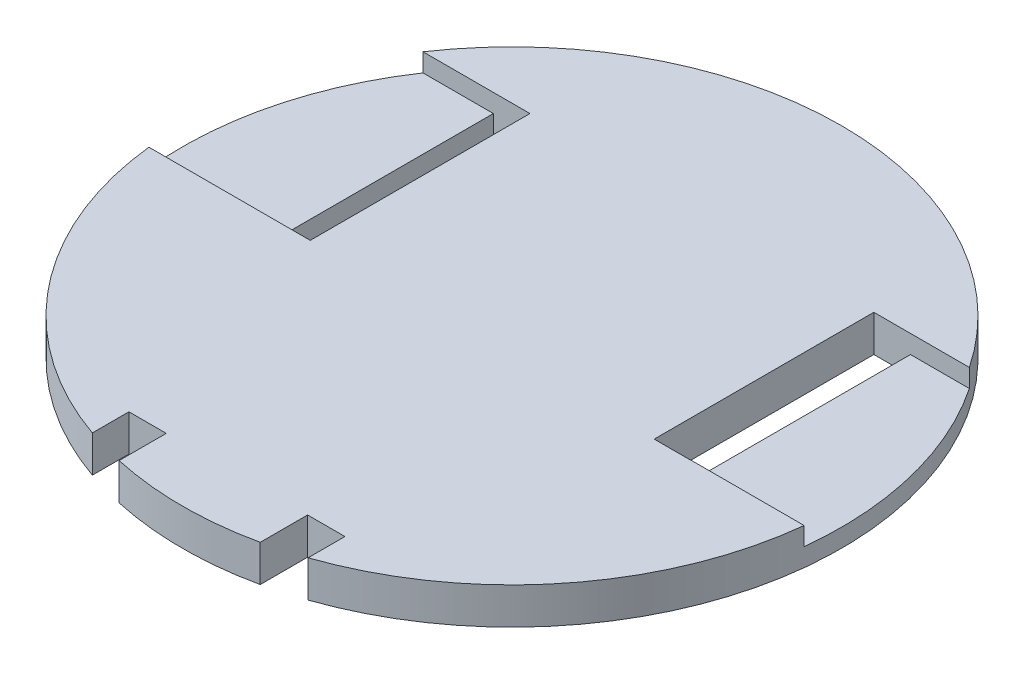
ISO-10303-21;
HEADER;
FILE_DESCRIPTION(('STEP AP214'),'2;1');
FILE_NAME('part.step','',(''),(''),'','','');
FILE_SCHEMA(('AUTOMOTIVE_DESIGN { 1 0 10303 214 1 1 1 1 }'));
ENDSEC;
DATA;
#1=APPLICATION_CONTEXT('core data for automotive mechanical design processes');
#2=APPLICATION_PROTOCOL_DEFINITION('international standard','automotive_design',2000,#1);
#3=PRODUCT_CONTEXT('',#1,'mechanical');
#4=PRODUCT('Part','Part','',(#3));
#5=PRODUCT_RELATED_PRODUCT_CATEGORY('part','',(#4));
#6=PRODUCT_DEFINITION_FORMATION('','',#4);
#7=PRODUCT_DEFINITION_CONTEXT('part definition',#1,'design');
#8=PRODUCT_DEFINITION('design','',#6,#7);
#9=PRODUCT_DEFINITION_SHAPE('','',#8);
#10=(LENGTH_UNIT() NAMED_UNIT(*) SI_UNIT(.MILLI.,.METRE.));
#11=(NAMED_UNIT(*) PLANE_ANGLE_UNIT() SI_UNIT($,.RADIAN.));
#12=(NAMED_UNIT(*) SI_UNIT($,.STERADIAN.) SOLID_ANGLE_UNIT());
#13=UNCERTAINTY_MEASURE_WITH_UNIT(LENGTH_MEASURE(1.E-05),#10,'distance_accuracy_value','');
#14=(GEOMETRIC_REPRESENTATION_CONTEXT(3) GLOBAL_UNCERTAINTY_ASSIGNED_CONTEXT((#13)) GLOBAL_UNIT_ASSIGNED_CONTEXT((#10,
#11,#12)) REPRESENTATION_CONTEXT('',''));
#15=CARTESIAN_POINT('',(0.,0.,0.));
#16=DIRECTION('',(0.,0.,1.));
#17=DIRECTION('',(1.,0.,0.));
#18=AXIS2_PLACEMENT_3D('',#15,#16,#17);
#19=CARTESIAN_POINT('',(-32.8829925528988,12.7,-35.0409389391828));
#20=DIRECTION('',(0.,-1.,0.));
#21=DIRECTION('',(0.,0.,-1.));
#22=AXIS2_PLACEMENT_3D('',#19,#20,#21);
#23=CYLINDRICAL_SURFACE('',#22,114.3);
#24=DIRECTION('',(0.,-1.,0.));
#25=VECTOR('',#24,1.);
#26=CARTESIAN_POINT('',(-57.5479572401736,12.7,76.5660927253835));
#27=LINE('',#26,#25);
#28=CARTESIAN_POINT('',(-57.5479572401736,0.,76.5660927253835));
#29=VERTEX_POINT('',#28);
#30=CARTESIAN_POINT('',(-57.5479572401736,12.7,76.5660927253835));
#31=VERTEX_POINT('',#30);
#32=EDGE_CURVE('E195',#29,#31,#27,.F.);
#33=ORIENTED_EDGE('',*,*,#32,.F.);
#34=CARTESIAN_POINT('',(-32.8829925528988,0.,-35.0409389391828));
#35=DIRECTION('',(0.,1.,0.));
#36=DIRECTION('',(0.,0.,1.));
#37=AXIS2_PLACEMENT_3D('',#34,#35,#36);
#38=CIRCLE('',#37,114.3);
#39=CARTESIAN_POINT('',(-8.52595724017365,0.,76.6336993220387));
#40=VERTEX_POINT('',#39);
#41=EDGE_CURVE('E286',#29,#40,#38,.T.);
#42=ORIENTED_EDGE('',*,*,#41,.T.);
#43=DIRECTION('',(0.,-1.,0.));
#44=VECTOR('',#43,1.);
#45=CARTESIAN_POINT('',(-8.52595724017366,12.7,76.6336993220387));
#46=LINE('',#45,#44);
#47=CARTESIAN_POINT('',(-8.52595724017365,12.7,76.6336993220387));
#48=VERTEX_POINT('',#47);
#49=EDGE_CURVE('E214',#40,#48,#46,.F.);
#50=ORIENTED_EDGE('',*,*,#49,.T.);
#51=CARTESIAN_POINT('',(-32.8829925528988,12.7,-35.0409389391828));
#52=DIRECTION('',(0.,1.,0.));
#53=DIRECTION('',(0.,0.,1.));
#54=AXIS2_PLACEMENT_3D('',#51,#52,#53);
#55=CIRCLE('',#54,114.3);
#56=EDGE_CURVE('E315',#31,#48,#55,.T.);
#57=ORIENTED_EDGE('',*,*,#56,.F.);
#58=EDGE_LOOP('',(#33,#42,#50,#57));
#59=FACE_BOUND('',#58,.T.);
#60=ADVANCED_FACE('F48',(#59),#23,.T.);
#61=CARTESIAN_POINT('',(4.42804275982635,0.,72.9978348593595));
#62=VERTEX_POINT('',#61);
#63=CARTESIAN_POINT('',(-70.5019572401736,0.,72.8910002440709));
#64=VERTEX_POINT('',#63);
#65=EDGE_CURVE('E319',#62,#64,#38,.T.);
#66=ORIENTED_EDGE('',*,*,#65,.T.);
#67=DIRECTION('',(0.,-1.,0.));
#68=VECTOR('',#67,1.);
#69=CARTESIAN_POINT('',(-70.5019572401736,12.7,72.8910002440709));
#70=LINE('',#69,#68);
#71=CARTESIAN_POINT('',(-70.5019572401736,12.7,72.8910002440709));
#72=VERTEX_POINT('',#71);
#73=EDGE_CURVE('E230',#64,#72,#70,.F.);
#74=ORIENTED_EDGE('',*,*,#73,.T.);
#75=CARTESIAN_POINT('',(-146.519377255521,12.7,-22.7420742876122));
#76=VERTEX_POINT('',#75);
#77=EDGE_CURVE('E312',#76,#72,#55,.T.);
#78=ORIENTED_EDGE('',*,*,#77,.F.);
#79=DIRECTION('',(0.,1.,0.));
#80=VECTOR('',#79,1.);
#81=CARTESIAN_POINT('',(-146.519377255521,6.35,-22.7420742876122));
#82=LINE('',#81,#80);
#83=CARTESIAN_POINT('',(-146.519377255521,6.35,-22.7420742876122));
#84=VERTEX_POINT('',#83);
#85=EDGE_CURVE('E246',#84,#76,#82,.T.);
#86=ORIENTED_EDGE('',*,*,#85,.F.);
#87=CARTESIAN_POINT('',(-32.8829925528988,6.35,-35.0409389391828));
#88=DIRECTION('',(0.,1.,0.));
#89=DIRECTION('',(0.,0.,1.));
#90=AXIS2_PLACEMENT_3D('',#87,#88,#89);
#91=CIRCLE('',#90,114.3);
#92=CARTESIAN_POINT('',(-127.651842399152,6.35,-98.9420742876122));
#93=VERTEX_POINT('',#92);
#94=EDGE_CURVE('E235',#93,#84,#91,.T.);
#95=ORIENTED_EDGE('',*,*,#94,.F.);
#96=DIRECTION('',(0.,1.,0.));
#97=VECTOR('',#96,1.);
#98=CARTESIAN_POINT('',(-127.651842399152,6.35,-98.9420742876122));
#99=LINE('',#98,#97);
#100=CARTESIAN_POINT('',(-127.651842399152,12.7,-98.9420742876122));
#101=VERTEX_POINT('',#100);
#102=EDGE_CURVE('E247',#93,#101,#99,.T.);
#103=ORIENTED_EDGE('',*,*,#102,.T.);
#104=CARTESIAN_POINT('',(61.9239866861581,12.7,-98.8854899013835));
#105=VERTEX_POINT('',#104);
#106=EDGE_CURVE('E314',#105,#101,#55,.T.);
#107=ORIENTED_EDGE('',*,*,#106,.F.);
#108=DIRECTION('',(0.,1.,0.));
#109=VECTOR('',#108,1.);
#110=CARTESIAN_POINT('',(61.9239866861581,6.35,-98.8854899013835));
#111=LINE('',#110,#109);
#112=CARTESIAN_POINT('',(61.9239866861581,6.35,-98.8854899013835));
#113=VERTEX_POINT('',#112);
#114=EDGE_CURVE('E239',#113,#105,#111,.T.);
#115=ORIENTED_EDGE('',*,*,#114,.F.);
#116=CARTESIAN_POINT('',(-32.8829925528988,6.35,-35.0409389391828));
#117=DIRECTION('',(0.,1.,0.));
#118=DIRECTION('',(0.,0.,1.));
#119=AXIS2_PLACEMENT_3D('',#116,#117,#118);
#120=CIRCLE('',#119,114.3);
#121=CARTESIAN_POINT('',(80.7533921497234,6.35,-22.7420742876122));
#122=VERTEX_POINT('',#121);
#123=EDGE_CURVE('E259',#122,#113,#120,.T.);
#124=ORIENTED_EDGE('',*,*,#123,.F.);
#125=DIRECTION('',(0.,1.,0.));
#126=VECTOR('',#125,1.);
#127=CARTESIAN_POINT('',(80.7533921497234,6.35,-22.7420742876122));
#128=LINE('',#127,#126);
#129=CARTESIAN_POINT('',(80.7533921497234,12.7,-22.7420742876122));
#130=VERTEX_POINT('',#129);
#131=EDGE_CURVE('E269',#122,#130,#128,.T.);
#132=ORIENTED_EDGE('',*,*,#131,.T.);
#133=CARTESIAN_POINT('',(4.42804275982635,12.7,72.9978348593595));
#134=VERTEX_POINT('',#133);
#135=EDGE_CURVE('E316',#134,#130,#55,.T.);
#136=ORIENTED_EDGE('',*,*,#135,.F.);
#137=DIRECTION('',(0.,-1.,0.));
#138=VECTOR('',#137,1.);
#139=CARTESIAN_POINT('',(4.42804275982633,12.7,72.9978348593595));
#140=LINE('',#139,#138);
#141=EDGE_CURVE('E228',#62,#134,#140,.F.);
#142=ORIENTED_EDGE('',*,*,#141,.F.);
#143=EDGE_LOOP('',(#66,#74,#78,#86,#95,#103,#107,#115,#124,#132,#136,#142));
#144=FACE_BOUND('',#143,.T.);
#145=ADVANCED_FACE('F360',(#144),#23,.T.);
#146=CARTESIAN_POINT('',(-32.8829925528988,12.7,-35.0409389391828));
#147=DIRECTION('',(0.,1.,0.));
#148=DIRECTION('',(0.,0.,1.));
#149=AXIS2_PLACEMENT_3D('',#146,#147,#148);
#150=PLANE('',#149);
#151=DIRECTION('',(1.,0.,0.));
#152=VECTOR('',#151,1.);
#153=CARTESIAN_POINT('',(0.,12.7,60.2090610608172));
#154=LINE('',#153,#152);
#155=CARTESIAN_POINT('',(-70.5019572401736,12.7,60.2090610608172));
#156=VERTEX_POINT('',#155);
#157=CARTESIAN_POINT('',(-57.5479572401736,12.7,60.2090610608172));
#158=VERTEX_POINT('',#157);
#159=EDGE_CURVE('E203',#156,#158,#154,.T.);
#160=ORIENTED_EDGE('',*,*,#159,.T.);
#161=DIRECTION('',(0.,0.,1.));
#162=VECTOR('',#161,1.);
#163=CARTESIAN_POINT('',(-57.5479572401736,12.7,60.2090610608172));
#164=LINE('',#163,#162);
#165=EDGE_CURVE('E189',#158,#31,#164,.T.);
#166=ORIENTED_EDGE('',*,*,#165,.T.);
#167=ORIENTED_EDGE('',*,*,#56,.T.);
#168=DIRECTION('',(0.,0.,1.));
#169=VECTOR('',#168,1.);
#170=CARTESIAN_POINT('',(-8.52595724017365,12.7,60.2090610608172));
#171=LINE('',#170,#169);
#172=CARTESIAN_POINT('',(-8.52595724017365,12.7,60.2090610608172));
#173=VERTEX_POINT('',#172);
#174=EDGE_CURVE('E206',#173,#48,#171,.T.);
#175=ORIENTED_EDGE('',*,*,#174,.F.);
#176=DIRECTION('',(-1.,0.,0.));
#177=VECTOR('',#176,1.);
#178=CARTESIAN_POINT('',(0.,12.7,60.2090610608172));
#179=LINE('',#178,#177);
#180=CARTESIAN_POINT('',(4.42804275982635,12.7,60.2090610608172));
#181=VERTEX_POINT('',#180);
#182=EDGE_CURVE('E219',#181,#173,#179,.T.);
#183=ORIENTED_EDGE('',*,*,#182,.F.);
#184=DIRECTION('',(0.,0.,1.));
#185=VECTOR('',#184,1.);
#186=CARTESIAN_POINT('',(4.42804275982635,12.7,60.2090610608172));
#187=LINE('',#186,#185);
#188=EDGE_CURVE('E222',#181,#134,#187,.T.);
#189=ORIENTED_EDGE('',*,*,#188,.T.);
#190=ORIENTED_EDGE('',*,*,#135,.T.);
#191=DIRECTION('',(1.,0.,0.));
#192=VECTOR('',#191,1.);
#193=CARTESIAN_POINT('',(0.,12.7,-22.7420742876122));
#194=LINE('',#193,#192);
#195=CARTESIAN_POINT('',(41.4964951717778,12.7,-22.7420742876122));
#196=VERTEX_POINT('',#195);
#197=EDGE_CURVE('E234',#196,#130,#194,.T.);
#198=ORIENTED_EDGE('',*,*,#197,.F.);
#199=DIRECTION('',(0.,0.,-1.));
#200=VECTOR('',#199,1.);
#201=CARTESIAN_POINT('',(41.4964951717778,12.7,-98.8854899013835));
#202=LINE('',#201,#200);
#203=CARTESIAN_POINT('',(41.4964951717778,12.7,-22.6854899013835));
#204=VERTEX_POINT('',#203);
#205=EDGE_CURVE('E297',#204,#196,#202,.T.);
#206=ORIENTED_EDGE('',*,*,#205,.F.);
#207=DIRECTION('',(1.,0.,0.));
#208=VECTOR('',#207,1.);
#209=CARTESIAN_POINT('',(28.7964951717778,12.7,-22.6854899013835));
#210=LINE('',#209,#208);
#211=CARTESIAN_POINT('',(28.7964951717778,12.7,-22.6854899013835));
#212=VERTEX_POINT('',#211);
#213=EDGE_CURVE('E294',#212,#204,#210,.T.);
#214=ORIENTED_EDGE('',*,*,#213,.F.);
#215=DIRECTION('',(0.,0.,1.));
#216=VECTOR('',#215,1.);
#217=CARTESIAN_POINT('',(28.7964951717778,12.7,-98.8854899013835));
#218=LINE('',#217,#216);
#219=CARTESIAN_POINT('',(28.7964951717778,12.7,-98.8854899013835));
#220=VERTEX_POINT('',#219);
#221=EDGE_CURVE('E250',#220,#212,#218,.T.);
#222=ORIENTED_EDGE('',*,*,#221,.F.);
#223=DIRECTION('',(-1.,0.,0.));
#224=VECTOR('',#223,1.);
#225=CARTESIAN_POINT('',(28.7964951717778,12.7,-98.8854899013835));
#226=LINE('',#225,#224);
#227=EDGE_CURVE('E300',#105,#220,#226,.T.);
#228=ORIENTED_EDGE('',*,*,#227,.F.);
#229=ORIENTED_EDGE('',*,*,#106,.T.);
#230=DIRECTION('',(-1.,0.,0.));
#231=VECTOR('',#230,1.);
#232=CARTESIAN_POINT('',(-103.244009407073,12.6999999999953,-98.9420742876122));
#233=LINE('',#232,#231);
#234=CARTESIAN_POINT('',(-90.5440094070732,12.6999999999953,-98.9420742876122));
#235=VERTEX_POINT('',#234);
#236=EDGE_CURVE('E280',#235,#101,#233,.T.);
#237=ORIENTED_EDGE('',*,*,#236,.F.);
#238=DIRECTION('',(0.,0.,-1.));
#239=VECTOR('',#238,1.);
#240=CARTESIAN_POINT('',(-90.5440094070732,12.6999999999953,-98.9420742876122));
#241=LINE('',#240,#239);
#242=CARTESIAN_POINT('',(-90.5440094070732,12.6999999999953,-22.7420742876122));
#243=VERTEX_POINT('',#242);
#244=EDGE_CURVE('E276',#243,#235,#241,.T.);
#245=ORIENTED_EDGE('',*,*,#244,.F.);
#246=DIRECTION('',(1.,0.,0.));
#247=VECTOR('',#246,1.);
#248=CARTESIAN_POINT('',(-103.244009407073,12.6999999999953,-22.7420742876122));
#249=LINE('',#248,#247);
#250=EDGE_CURVE('E273',#76,#243,#249,.T.);
#251=ORIENTED_EDGE('',*,*,#250,.F.);
#252=ORIENTED_EDGE('',*,*,#77,.T.);
#253=DIRECTION('',(0.,0.,1.));
#254=VECTOR('',#253,1.);
#255=CARTESIAN_POINT('',(-70.5019572401736,12.7,60.2090610608172));
#256=LINE('',#255,#254);
#257=EDGE_CURVE('E200',#156,#72,#256,.T.);
#258=ORIENTED_EDGE('',*,*,#257,.F.);
#259=EDGE_LOOP('',(#160,#166,#167,#175,#183,#189,#190,#198,#206,#214,#222,#228,#229,#237,#245,
#251,#252,#258));
#260=FACE_BOUND('',#259,.T.);
#261=ADVANCED_FACE('F209',(#260),#150,.T.);
#262=CARTESIAN_POINT('',(-32.8829925528988,0.,-35.0409389391828));
#263=DIRECTION('',(0.,1.,0.));
#264=DIRECTION('',(0.,0.,1.));
#265=AXIS2_PLACEMENT_3D('',#262,#263,#264);
#266=PLANE('',#265);
#267=DIRECTION('',(-1.,0.,0.));
#268=VECTOR('',#267,1.);
#269=CARTESIAN_POINT('',(-32.8829925528988,0.,-98.9420742876122));
#270=LINE('',#269,#268);
#271=CARTESIAN_POINT('',(-90.5440094070732,0.,-98.9420742876122));
#272=VERTEX_POINT('',#271);
#273=CARTESIAN_POINT('',(-103.244009407073,0.,-98.9420742876122));
#274=VERTEX_POINT('',#273);
#275=EDGE_CURVE('E338',#272,#274,#270,.T.);
#276=ORIENTED_EDGE('',*,*,#275,.T.);
#277=DIRECTION('',(0.,0.,1.));
#278=VECTOR('',#277,1.);
#279=CARTESIAN_POINT('',(-103.244009407073,0.,-35.0409389391828));
#280=LINE('',#279,#278);
#281=CARTESIAN_POINT('',(-103.244009407073,0.,-22.7420742876122));
#282=VERTEX_POINT('',#281);
#283=EDGE_CURVE('E341',#274,#282,#280,.T.);
#284=ORIENTED_EDGE('',*,*,#283,.T.);
#285=DIRECTION('',(1.,0.,0.));
#286=VECTOR('',#285,1.);
#287=CARTESIAN_POINT('',(-32.8829925528988,0.,-22.7420742876122));
#288=LINE('',#287,#286);
#289=CARTESIAN_POINT('',(-90.5440094070732,0.,-22.7420742876122));
#290=VERTEX_POINT('',#289);
#291=EDGE_CURVE('E332',#282,#290,#288,.T.);
#292=ORIENTED_EDGE('',*,*,#291,.T.);
#293=DIRECTION('',(0.,0.,-1.));
#294=VECTOR('',#293,1.);
#295=CARTESIAN_POINT('',(-90.5440094070732,0.,-35.0409389391828));
#296=LINE('',#295,#294);
#297=EDGE_CURVE('E335',#290,#272,#296,.T.);
#298=ORIENTED_EDGE('',*,*,#297,.T.);
#299=EDGE_LOOP('',(#276,#284,#292,#298));
#300=FACE_BOUND('',#299,.T.);
#301=DIRECTION('',(-1.,0.,0.));
#302=VECTOR('',#301,1.);
#303=CARTESIAN_POINT('',(-32.8829925528988,0.,-98.8854899013835));
#304=LINE('',#303,#302);
#305=CARTESIAN_POINT('',(41.4964951717778,0.,-98.8854899013835));
#306=VERTEX_POINT('',#305);
#307=CARTESIAN_POINT('',(28.7964951717778,0.,-98.8854899013835));
#308=VERTEX_POINT('',#307);
#309=EDGE_CURVE('E326',#306,#308,#304,.T.);
#310=ORIENTED_EDGE('',*,*,#309,.T.);
#311=DIRECTION('',(0.,0.,1.));
#312=VECTOR('',#311,1.);
#313=CARTESIAN_POINT('',(28.7964951717778,0.,-35.0409389391828));
#314=LINE('',#313,#312);
#315=CARTESIAN_POINT('',(28.7964951717778,0.,-22.6854899013835));
#316=VERTEX_POINT('',#315);
#317=EDGE_CURVE('E329',#308,#316,#314,.T.);
#318=ORIENTED_EDGE('',*,*,#317,.T.);
#319=DIRECTION('',(1.,0.,0.));
#320=VECTOR('',#319,1.);
#321=CARTESIAN_POINT('',(-32.8829925528988,0.,-22.6854899013835));
#322=LINE('',#321,#320);
#323=CARTESIAN_POINT('',(41.4964951717778,0.,-22.6854899013835));
#324=VERTEX_POINT('',#323);
#325=EDGE_CURVE('E320',#316,#324,#322,.T.);
#326=ORIENTED_EDGE('',*,*,#325,.T.);
#327=DIRECTION('',(0.,0.,-1.));
#328=VECTOR('',#327,1.);
#329=CARTESIAN_POINT('',(41.4964951717778,0.,-35.0409389391828));
#330=LINE('',#329,#328);
#331=EDGE_CURVE('E323',#324,#306,#330,.T.);
#332=ORIENTED_EDGE('',*,*,#331,.T.);
#333=EDGE_LOOP('',(#310,#318,#326,#332));
#334=FACE_BOUND('',#333,.T.);
#335=DIRECTION('',(0.,0.,1.));
#336=VECTOR('',#335,1.);
#337=CARTESIAN_POINT('',(-57.5479572401736,0.,-35.0409389391828));
#338=LINE('',#337,#336);
#339=CARTESIAN_POINT('',(-57.5479572401736,0.,60.2090610608172));
#340=VERTEX_POINT('',#339);
#341=EDGE_CURVE('E11',#340,#29,#338,.T.);
#342=ORIENTED_EDGE('',*,*,#341,.F.);
#343=DIRECTION('',(1.,0.,0.));
#344=VECTOR('',#343,1.);
#345=CARTESIAN_POINT('',(-32.8829925528988,0.,60.2090610608172));
#346=LINE('',#345,#344);
#347=CARTESIAN_POINT('',(-70.5019572401736,0.,60.2090610608172));
#348=VERTEX_POINT('',#347);
#349=EDGE_CURVE('E205',#348,#340,#346,.T.);
#350=ORIENTED_EDGE('',*,*,#349,.F.);
#351=DIRECTION('',(0.,0.,1.));
#352=VECTOR('',#351,1.);
#353=CARTESIAN_POINT('',(-70.5019572401736,0.,-35.0409389391828));
#354=LINE('',#353,#352);
#355=EDGE_CURVE('E55',#348,#64,#354,.T.);
#356=ORIENTED_EDGE('',*,*,#355,.T.);
#357=ORIENTED_EDGE('',*,*,#65,.F.);
#358=DIRECTION('',(0.,0.,1.));
#359=VECTOR('',#358,1.);
#360=CARTESIAN_POINT('',(4.42804275982635,0.,-35.0409389391828));
#361=LINE('',#360,#359);
#362=CARTESIAN_POINT('',(4.42804275982635,0.,60.2090610608172));
#363=VERTEX_POINT('',#362);
#364=EDGE_CURVE('E349',#363,#62,#361,.T.);
#365=ORIENTED_EDGE('',*,*,#364,.F.);
#366=DIRECTION('',(1.,0.,0.));
#367=VECTOR('',#366,1.);
#368=CARTESIAN_POINT('',(-32.8829925528988,0.,60.2090610608172));
#369=LINE('',#368,#367);
#370=CARTESIAN_POINT('',(-8.52595724017365,0.,60.2090610608172));
#371=VERTEX_POINT('',#370);
#372=EDGE_CURVE('E344',#371,#363,#369,.T.);
#373=ORIENTED_EDGE('',*,*,#372,.F.);
#374=DIRECTION('',(0.,0.,1.));
#375=VECTOR('',#374,1.);
#376=CARTESIAN_POINT('',(-8.52595724017365,0.,-35.0409389391828));
#377=LINE('',#376,#375);
#378=EDGE_CURVE('E346',#371,#40,#377,.T.);
#379=ORIENTED_EDGE('',*,*,#378,.T.);
#380=ORIENTED_EDGE('',*,*,#41,.F.);
#381=EDGE_LOOP('',(#342,#350,#356,#357,#365,#373,#379,#380));
#382=FACE_BOUND('',#381,.T.);
#383=ADVANCED_FACE('F355',(#300,#334,#382),#266,.F.);
#384=CARTESIAN_POINT('',(-103.244009407073,-22.0980000000047,-98.9420742876122));
#385=DIRECTION('',(-1.,0.,0.));
#386=DIRECTION('',(0.,0.,1.));
#387=AXIS2_PLACEMENT_3D('',#384,#385,#386);
#388=PLANE('',#387);
#389=DIRECTION('',(0.,0.,-1.));
#390=VECTOR('',#389,1.);
#391=CARTESIAN_POINT('',(-103.244009407073,6.35,0.));
#392=LINE('',#391,#390);
#393=CARTESIAN_POINT('',(-103.244009407073,6.35,-22.7420742876122));
#394=VERTEX_POINT('',#393);
#395=CARTESIAN_POINT('',(-103.244009407073,6.35,-98.9420742876122));
#396=VERTEX_POINT('',#395);
#397=EDGE_CURVE('E241',#394,#396,#392,.T.);
#398=ORIENTED_EDGE('',*,*,#397,.F.);
#399=DIRECTION('',(0.,1.,0.));
#400=VECTOR('',#399,1.);
#401=CARTESIAN_POINT('',(-103.244009407073,-22.0980000000047,-22.7420742876122));
#402=LINE('',#401,#400);
#403=EDGE_CURVE('E282',#282,#394,#402,.T.);
#404=ORIENTED_EDGE('',*,*,#403,.F.);
#405=ORIENTED_EDGE('',*,*,#283,.F.);
#406=DIRECTION('',(0.,1.,0.));
#407=VECTOR('',#406,1.);
#408=CARTESIAN_POINT('',(-103.244009407073,-22.0980000000047,-98.9420742876122));
#409=LINE('',#408,#407);
#410=EDGE_CURVE('E283',#274,#396,#409,.T.);
#411=ORIENTED_EDGE('',*,*,#410,.T.);
#412=EDGE_LOOP('',(#398,#404,#405,#411));
#413=FACE_BOUND('',#412,.T.);
#414=ADVANCED_FACE('F382',(#413),#388,.F.);
#415=CARTESIAN_POINT('',(28.7964951717778,-16.0404012886089,-98.8854899013835));
#416=DIRECTION('',(-1.,0.,0.));
#417=DIRECTION('',(0.,0.,1.));
#418=AXIS2_PLACEMENT_3D('',#415,#416,#417);
#419=PLANE('',#418);
#420=DIRECTION('',(0.,1.,0.));
#421=VECTOR('',#420,1.);
#422=CARTESIAN_POINT('',(28.7964951717778,-16.0404012886089,-98.8854899013835));
#423=LINE('',#422,#421);
#424=EDGE_CURVE('E277',#308,#220,#423,.T.);
#425=ORIENTED_EDGE('',*,*,#424,.T.);
#426=ORIENTED_EDGE('',*,*,#221,.T.);
#427=DIRECTION('',(0.,1.,0.));
#428=VECTOR('',#427,1.);
#429=CARTESIAN_POINT('',(28.7964951717778,-16.0404012886089,-22.6854899013835));
#430=LINE('',#429,#428);
#431=EDGE_CURVE('E303',#316,#212,#430,.T.);
#432=ORIENTED_EDGE('',*,*,#431,.F.);
#433=ORIENTED_EDGE('',*,*,#317,.F.);
#434=EDGE_LOOP('',(#425,#426,#432,#433));
#435=FACE_BOUND('',#434,.T.);
#436=ADVANCED_FACE('F448',(#435),#419,.F.);
#437=CARTESIAN_POINT('',(28.7964951717778,-16.0404012886089,-98.8854899013835));
#438=DIRECTION('',(0.,0.,-1.));
#439=DIRECTION('',(-1.,0.,0.));
#440=AXIS2_PLACEMENT_3D('',#437,#438,#439);
#441=PLANE('',#440);
#442=DIRECTION('',(0.,1.,0.));
#443=VECTOR('',#442,1.);
#444=CARTESIAN_POINT('',(41.4964951717778,-16.0404012886089,-98.8854899013835));
#445=LINE('',#444,#443);
#446=CARTESIAN_POINT('',(41.4964951717778,6.34999999999999,-98.8854899013835));
#447=VERTEX_POINT('',#446);
#448=EDGE_CURVE('E305',#306,#447,#445,.T.);
#449=ORIENTED_EDGE('',*,*,#448,.T.);
#450=DIRECTION('',(1.,0.,0.));
#451=VECTOR('',#450,1.);
#452=CARTESIAN_POINT('',(0.,6.35,-98.8854899013835));
#453=LINE('',#452,#451);
#454=EDGE_CURVE('E262',#447,#113,#453,.T.);
#455=ORIENTED_EDGE('',*,*,#454,.T.);
#456=ORIENTED_EDGE('',*,*,#114,.T.);
#457=ORIENTED_EDGE('',*,*,#227,.T.);
#458=ORIENTED_EDGE('',*,*,#424,.F.);
#459=ORIENTED_EDGE('',*,*,#309,.F.);
#460=EDGE_LOOP('',(#449,#455,#456,#457,#458,#459));
#461=FACE_BOUND('',#460,.T.);
#462=ADVANCED_FACE('F451',(#461),#441,.F.);
#463=CARTESIAN_POINT('',(41.4964951717778,-16.0404012886089,-98.8854899013835));
#464=DIRECTION('',(1.,0.,0.));
#465=DIRECTION('',(0.,0.,-1.));
#466=AXIS2_PLACEMENT_3D('',#463,#464,#465);
#467=PLANE('',#466);
#468=ORIENTED_EDGE('',*,*,#205,.T.);
#469=DIRECTION('',(0.,1.,0.));
#470=VECTOR('',#469,1.);
#471=CARTESIAN_POINT('',(41.4964951717778,6.35,-22.7420742876122));
#472=LINE('',#471,#470);
#473=CARTESIAN_POINT('',(41.4964951717778,6.35,-22.7420742876122));
#474=VERTEX_POINT('',#473);
#475=EDGE_CURVE('E264',#474,#196,#472,.T.);
#476=ORIENTED_EDGE('',*,*,#475,.F.);
#477=DIRECTION('',(0.,0.,1.));
#478=VECTOR('',#477,1.);
#479=CARTESIAN_POINT('',(41.4964951717778,6.35,0.));
#480=LINE('',#479,#478);
#481=EDGE_CURVE('E253',#447,#474,#480,.T.);
#482=ORIENTED_EDGE('',*,*,#481,.F.);
#483=ORIENTED_EDGE('',*,*,#448,.F.);
#484=ORIENTED_EDGE('',*,*,#331,.F.);
#485=DIRECTION('',(0.,1.,0.));
#486=VECTOR('',#485,1.);
#487=CARTESIAN_POINT('',(41.4964951717778,-16.0404012886089,-22.6854899013835));
#488=LINE('',#487,#486);
#489=EDGE_CURVE('E308',#324,#204,#488,.T.);
#490=ORIENTED_EDGE('',*,*,#489,.T.);
#491=EDGE_LOOP('',(#468,#476,#482,#483,#484,#490));
#492=FACE_BOUND('',#491,.T.);
#493=ADVANCED_FACE('F442',(#492),#467,.F.);
#494=CARTESIAN_POINT('',(28.7964951717778,-16.0404012886089,-22.6854899013835));
#495=DIRECTION('',(0.,0.,1.));
#496=DIRECTION('',(1.,0.,0.));
#497=AXIS2_PLACEMENT_3D('',#494,#495,#496);
#498=PLANE('',#497);
#499=ORIENTED_EDGE('',*,*,#431,.T.);
#500=ORIENTED_EDGE('',*,*,#213,.T.);
#501=ORIENTED_EDGE('',*,*,#489,.F.);
#502=ORIENTED_EDGE('',*,*,#325,.F.);
#503=EDGE_LOOP('',(#499,#500,#501,#502));
#504=FACE_BOUND('',#503,.T.);
#505=ADVANCED_FACE('F400',(#504),#498,.F.);
#506=CARTESIAN_POINT('',(-103.244009407073,-22.0980000000047,-98.9420742876122));
#507=DIRECTION('',(0.,0.,-1.));
#508=DIRECTION('',(-1.,0.,0.));
#509=AXIS2_PLACEMENT_3D('',#506,#507,#508);
#510=PLANE('',#509);
#511=DIRECTION('',(0.,1.,0.));
#512=VECTOR('',#511,1.);
#513=CARTESIAN_POINT('',(-90.5440094070732,-22.0980000000047,-98.9420742876122));
#514=LINE('',#513,#512);
#515=EDGE_CURVE('E287',#272,#235,#514,.T.);
#516=ORIENTED_EDGE('',*,*,#515,.T.);
#517=ORIENTED_EDGE('',*,*,#236,.T.);
#518=ORIENTED_EDGE('',*,*,#102,.F.);
#519=DIRECTION('',(-1.,0.,0.));
#520=VECTOR('',#519,1.);
#521=CARTESIAN_POINT('',(0.,6.35,-98.9420742876122));
#522=LINE('',#521,#520);
#523=EDGE_CURVE('E243',#396,#93,#522,.T.);
#524=ORIENTED_EDGE('',*,*,#523,.F.);
#525=ORIENTED_EDGE('',*,*,#410,.F.);
#526=ORIENTED_EDGE('',*,*,#275,.F.);
#527=EDGE_LOOP('',(#516,#517,#518,#524,#525,#526));
#528=FACE_BOUND('',#527,.T.);
#529=ADVANCED_FACE('F375',(#528),#510,.F.);
#530=CARTESIAN_POINT('',(-90.5440094070732,-22.0980000000047,-98.9420742876122));
#531=DIRECTION('',(1.,0.,0.));
#532=DIRECTION('',(0.,0.,-1.));
#533=AXIS2_PLACEMENT_3D('',#530,#531,#532);
#534=PLANE('',#533);
#535=DIRECTION('',(0.,1.,0.));
#536=VECTOR('',#535,1.);
#537=CARTESIAN_POINT('',(-90.5440094070732,-22.0980000000047,-22.7420742876122));
#538=LINE('',#537,#536);
#539=EDGE_CURVE('E289',#290,#243,#538,.T.);
#540=ORIENTED_EDGE('',*,*,#539,.T.);
#541=ORIENTED_EDGE('',*,*,#244,.T.);
#542=ORIENTED_EDGE('',*,*,#515,.F.);
#543=ORIENTED_EDGE('',*,*,#297,.F.);
#544=EDGE_LOOP('',(#540,#541,#542,#543));
#545=FACE_BOUND('',#544,.T.);
#546=ADVANCED_FACE('F390',(#545),#534,.F.);
#547=CARTESIAN_POINT('',(-103.244009407073,-22.0980000000047,-22.7420742876122));
#548=DIRECTION('',(0.,0.,1.));
#549=DIRECTION('',(1.,0.,0.));
#550=AXIS2_PLACEMENT_3D('',#547,#548,#549);
#551=PLANE('',#550);
#552=ORIENTED_EDGE('',*,*,#403,.T.);
#553=DIRECTION('',(-1.,0.,0.));
#554=VECTOR('',#553,1.);
#555=CARTESIAN_POINT('',(0.,6.35,-22.7420742876122));
#556=LINE('',#555,#554);
#557=EDGE_CURVE('E238',#394,#84,#556,.T.);
#558=ORIENTED_EDGE('',*,*,#557,.T.);
#559=ORIENTED_EDGE('',*,*,#85,.T.);
#560=ORIENTED_EDGE('',*,*,#250,.T.);
#561=ORIENTED_EDGE('',*,*,#539,.F.);
#562=ORIENTED_EDGE('',*,*,#291,.F.);
#563=EDGE_LOOP('',(#552,#558,#559,#560,#561,#562));
#564=FACE_BOUND('',#563,.T.);
#565=ADVANCED_FACE('F384',(#564),#551,.F.);
#566=CARTESIAN_POINT('',(0.,6.35,0.));
#567=DIRECTION('',(0.,1.,0.));
#568=DIRECTION('',(0.,0.,1.));
#569=AXIS2_PLACEMENT_3D('',#566,#567,#568);
#570=PLANE('',#569);
#571=ORIENTED_EDGE('',*,*,#94,.T.);
#572=ORIENTED_EDGE('',*,*,#557,.F.);
#573=ORIENTED_EDGE('',*,*,#397,.T.);
#574=ORIENTED_EDGE('',*,*,#523,.T.);
#575=EDGE_LOOP('',(#571,#572,#573,#574));
#576=FACE_BOUND('',#575,.T.);
#577=ADVANCED_FACE('F378',(#576),#570,.T.);
#578=CARTESIAN_POINT('',(0.,6.35,0.));
#579=DIRECTION('',(0.,1.,0.));
#580=DIRECTION('',(0.,0.,1.));
#581=AXIS2_PLACEMENT_3D('',#578,#579,#580);
#582=PLANE('',#581);
#583=DIRECTION('',(1.,0.,0.));
#584=VECTOR('',#583,1.);
#585=CARTESIAN_POINT('',(0.,6.35,-22.7420742876122));
#586=LINE('',#585,#584);
#587=EDGE_CURVE('E256',#474,#122,#586,.T.);
#588=ORIENTED_EDGE('',*,*,#587,.T.);
#589=ORIENTED_EDGE('',*,*,#123,.T.);
#590=ORIENTED_EDGE('',*,*,#454,.F.);
#591=ORIENTED_EDGE('',*,*,#481,.T.);
#592=EDGE_LOOP('',(#588,#589,#590,#591));
#593=FACE_BOUND('',#592,.T.);
#594=ADVANCED_FACE('F425',(#593),#582,.T.);
#595=CARTESIAN_POINT('',(0.,6.35,-22.7420742876122));
#596=DIRECTION('',(0.,0.,1.));
#597=DIRECTION('',(1.,0.,0.));
#598=AXIS2_PLACEMENT_3D('',#595,#596,#597);
#599=PLANE('',#598);
#600=ORIENTED_EDGE('',*,*,#197,.T.);
#601=ORIENTED_EDGE('',*,*,#131,.F.);
#602=ORIENTED_EDGE('',*,*,#587,.F.);
#603=ORIENTED_EDGE('',*,*,#475,.T.);
#604=EDGE_LOOP('',(#600,#601,#602,#603));
#605=FACE_BOUND('',#604,.T.);
#606=ADVANCED_FACE('F418',(#605),#599,.F.);
#607=CARTESIAN_POINT('',(4.42804275982635,0.,60.2090610608172));
#608=DIRECTION('',(-1.,0.,0.));
#609=DIRECTION('',(0.,0.,1.));
#610=AXIS2_PLACEMENT_3D('',#607,#608,#609);
#611=PLANE('',#610);
#612=ORIENTED_EDGE('',*,*,#141,.T.);
#613=ORIENTED_EDGE('',*,*,#188,.F.);
#614=DIRECTION('',(0.,-1.,0.));
#615=VECTOR('',#614,1.);
#616=CARTESIAN_POINT('',(4.42804275982635,0.,60.2090610608172));
#617=LINE('',#616,#615);
#618=EDGE_CURVE('E216',#181,#363,#617,.T.);
#619=ORIENTED_EDGE('',*,*,#618,.T.);
#620=ORIENTED_EDGE('',*,*,#364,.T.);
#621=EDGE_LOOP('',(#612,#613,#619,#620));
#622=FACE_BOUND('',#621,.T.);
#623=ADVANCED_FACE('F416',(#622),#611,.T.);
#624=CARTESIAN_POINT('',(-8.52595724017365,0.,60.2090610608172));
#625=DIRECTION('',(-1.,0.,0.));
#626=DIRECTION('',(0.,0.,1.));
#627=AXIS2_PLACEMENT_3D('',#624,#625,#626);
#628=PLANE('',#627);
#629=ORIENTED_EDGE('',*,*,#378,.F.);
#630=DIRECTION('',(0.,-1.,0.));
#631=VECTOR('',#630,1.);
#632=CARTESIAN_POINT('',(-8.52595724017365,0.,60.2090610608172));
#633=LINE('',#632,#631);
#634=EDGE_CURVE('E70',#173,#371,#633,.T.);
#635=ORIENTED_EDGE('',*,*,#634,.F.);
#636=ORIENTED_EDGE('',*,*,#174,.T.);
#637=ORIENTED_EDGE('',*,*,#49,.F.);
#638=EDGE_LOOP('',(#629,#635,#636,#637));
#639=FACE_BOUND('',#638,.T.);
#640=ADVANCED_FACE('F411',(#639),#628,.F.);
#641=CARTESIAN_POINT('',(0.,0.,60.2090610608172));
#642=DIRECTION('',(0.,0.,1.));
#643=DIRECTION('',(1.,0.,0.));
#644=AXIS2_PLACEMENT_3D('',#641,#642,#643);
#645=PLANE('',#644);
#646=ORIENTED_EDGE('',*,*,#372,.T.);
#647=ORIENTED_EDGE('',*,*,#618,.F.);
#648=ORIENTED_EDGE('',*,*,#182,.T.);
#649=ORIENTED_EDGE('',*,*,#634,.T.);
#650=EDGE_LOOP('',(#646,#647,#648,#649));
#651=FACE_BOUND('',#650,.T.);
#652=ADVANCED_FACE('F414',(#651),#645,.T.);
#653=CARTESIAN_POINT('',(-57.5479572401736,0.,60.2090610608172));
#654=DIRECTION('',(-1.,0.,0.));
#655=DIRECTION('',(0.,0.,1.));
#656=AXIS2_PLACEMENT_3D('',#653,#654,#655);
#657=PLANE('',#656);
#658=ORIENTED_EDGE('',*,*,#32,.T.);
#659=ORIENTED_EDGE('',*,*,#165,.F.);
#660=DIRECTION('',(0.,-1.,0.));
#661=VECTOR('',#660,1.);
#662=CARTESIAN_POINT('',(-57.5479572401736,0.,60.2090610608172));
#663=LINE('',#662,#661);
#664=EDGE_CURVE('E192',#158,#340,#663,.T.);
#665=ORIENTED_EDGE('',*,*,#664,.T.);
#666=ORIENTED_EDGE('',*,*,#341,.T.);
#667=EDGE_LOOP('',(#658,#659,#665,#666));
#668=FACE_BOUND('',#667,.T.);
#669=ADVANCED_FACE('F191',(#668),#657,.T.);
#670=CARTESIAN_POINT('',(-70.5019572401736,0.,60.2090610608172));
#671=DIRECTION('',(-1.,0.,0.));
#672=DIRECTION('',(0.,0.,1.));
#673=AXIS2_PLACEMENT_3D('',#670,#671,#672);
#674=PLANE('',#673);
#675=ORIENTED_EDGE('',*,*,#355,.F.);
#676=DIRECTION('',(0.,-1.,0.));
#677=VECTOR('',#676,1.);
#678=CARTESIAN_POINT('',(-70.5019572401736,0.,60.2090610608172));
#679=LINE('',#678,#677);
#680=EDGE_CURVE('E62',#156,#348,#679,.T.);
#681=ORIENTED_EDGE('',*,*,#680,.F.);
#682=ORIENTED_EDGE('',*,*,#257,.T.);
#683=ORIENTED_EDGE('',*,*,#73,.F.);
#684=EDGE_LOOP('',(#675,#681,#682,#683));
#685=FACE_BOUND('',#684,.T.);
#686=ADVANCED_FACE('F552',(#685),#674,.F.);
#687=CARTESIAN_POINT('',(0.,0.,60.2090610608172));
#688=DIRECTION('',(0.,0.,1.));
#689=DIRECTION('',(1.,0.,0.));
#690=AXIS2_PLACEMENT_3D('',#687,#688,#689);
#691=PLANE('',#690);
#692=ORIENTED_EDGE('',*,*,#349,.T.);
#693=ORIENTED_EDGE('',*,*,#664,.F.);
#694=ORIENTED_EDGE('',*,*,#159,.F.);
#695=ORIENTED_EDGE('',*,*,#680,.T.);
#696=EDGE_LOOP('',(#692,#693,#694,#695));
#697=FACE_BOUND('',#696,.T.);
#698=ADVANCED_FACE('F202',(#697),#691,.T.);
#699=CLOSED_SHELL('',(#60,#145,#261,#383,#414,#436,#462,#493,#505,#529,#546,#565,#577,#594,#606,
#623,#640,#652,#669,#686,#698));
#700=MANIFOLD_SOLID_BREP('B2',#699);
#701=ADVANCED_BREP_SHAPE_REPRESENTATION('',(#18,#700),#14);
#702=SHAPE_DEFINITION_REPRESENTATION(#9,#701);
ENDSEC;
END-ISO-10303-21;
